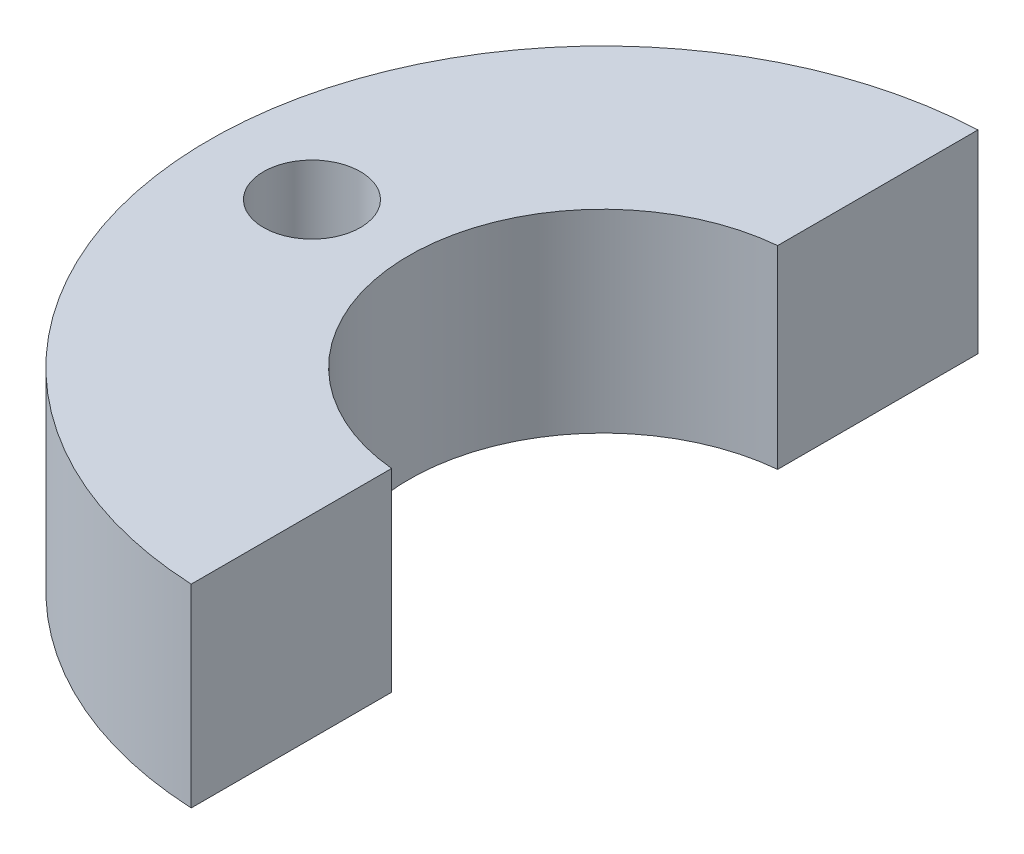
ISO-10303-21;
HEADER;
FILE_DESCRIPTION(('STEP AP214'),'2;1');
FILE_NAME('part.step','',(''),(''),'','','');
FILE_SCHEMA(('AUTOMOTIVE_DESIGN { 1 0 10303 214 1 1 1 1 }'));
ENDSEC;
DATA;
#1=APPLICATION_CONTEXT('core data for automotive mechanical design processes');
#2=APPLICATION_PROTOCOL_DEFINITION('international standard','automotive_design',2000,#1);
#3=PRODUCT_CONTEXT('',#1,'mechanical');
#4=PRODUCT('Part','Part','',(#3));
#5=PRODUCT_RELATED_PRODUCT_CATEGORY('part','',(#4));
#6=PRODUCT_DEFINITION_FORMATION('','',#4);
#7=PRODUCT_DEFINITION_CONTEXT('part definition',#1,'design');
#8=PRODUCT_DEFINITION('design','',#6,#7);
#9=PRODUCT_DEFINITION_SHAPE('','',#8);
#10=(LENGTH_UNIT() NAMED_UNIT(*) SI_UNIT(.MILLI.,.METRE.));
#11=(NAMED_UNIT(*) PLANE_ANGLE_UNIT() SI_UNIT($,.RADIAN.));
#12=(NAMED_UNIT(*) SI_UNIT($,.STERADIAN.) SOLID_ANGLE_UNIT());
#13=UNCERTAINTY_MEASURE_WITH_UNIT(LENGTH_MEASURE(1.E-05),#10,'distance_accuracy_value','');
#14=(GEOMETRIC_REPRESENTATION_CONTEXT(3) GLOBAL_UNCERTAINTY_ASSIGNED_CONTEXT((#13)) GLOBAL_UNIT_ASSIGNED_CONTEXT((#10,
#11,#12)) REPRESENTATION_CONTEXT('',''));
#15=CARTESIAN_POINT('',(0.,0.,0.));
#16=DIRECTION('',(0.,0.,1.));
#17=DIRECTION('',(1.,0.,0.));
#18=AXIS2_PLACEMENT_3D('',#15,#16,#17);
#19=CARTESIAN_POINT('',(-1.5,8.,0.));
#20=DIRECTION('',(1.,0.,0.));
#21=DIRECTION('',(0.,0.,-1.));
#22=AXIS2_PLACEMENT_3D('',#19,#20,#21);
#23=PLANE('',#22);
#24=DIRECTION('',(0.,0.,1.));
#25=VECTOR('',#24,1.);
#26=CARTESIAN_POINT('',(-1.5,-8.,0.));
#27=LINE('',#26,#25);
#28=CARTESIAN_POINT('',(-1.5,-8.,-32.4653661614959));
#29=VERTEX_POINT('',#28);
#30=CARTESIAN_POINT('',(-1.5,-8.,-15.929532322074));
#31=VERTEX_POINT('',#30);
#32=EDGE_CURVE('E106',#29,#31,#27,.T.);
#33=ORIENTED_EDGE('',*,*,#32,.F.);
#34=DIRECTION('',(0.,-1.,0.));
#35=VECTOR('',#34,1.);
#36=CARTESIAN_POINT('',(-1.5,8.,-32.4653661614959));
#37=LINE('',#36,#35);
#38=CARTESIAN_POINT('',(-1.5,8.,-32.4653661614959));
#39=VERTEX_POINT('',#38);
#40=EDGE_CURVE('E11',#39,#29,#37,.T.);
#41=ORIENTED_EDGE('',*,*,#40,.F.);
#42=DIRECTION('',(0.,0.,1.));
#43=VECTOR('',#42,1.);
#44=CARTESIAN_POINT('',(-1.5,8.,0.));
#45=LINE('',#44,#43);
#46=CARTESIAN_POINT('',(-1.5,8.,-15.929532322074));
#47=VERTEX_POINT('',#46);
#48=EDGE_CURVE('E88',#39,#47,#45,.T.);
#49=ORIENTED_EDGE('',*,*,#48,.T.);
#50=DIRECTION('',(0.,-1.,0.));
#51=VECTOR('',#50,1.);
#52=CARTESIAN_POINT('',(-1.5,8.,-15.929532322074));
#53=LINE('',#52,#51);
#54=EDGE_CURVE('E56',#47,#31,#53,.T.);
#55=ORIENTED_EDGE('',*,*,#54,.T.);
#56=EDGE_LOOP('',(#33,#41,#49,#55));
#57=FACE_BOUND('',#56,.T.);
#58=ADVANCED_FACE('F39',(#57),#23,.T.);
#59=CARTESIAN_POINT('',(0.,8.,0.));
#60=DIRECTION('',(0.,-1.,0.));
#61=DIRECTION('',(0.,0.,-1.));
#62=AXIS2_PLACEMENT_3D('',#59,#60,#61);
#63=CYLINDRICAL_SURFACE('',#62,32.5);
#64=CARTESIAN_POINT('',(0.,-8.,0.));
#65=DIRECTION('',(0.,1.,0.));
#66=DIRECTION('',(0.,0.,1.));
#67=AXIS2_PLACEMENT_3D('',#64,#65,#66);
#68=CIRCLE('',#67,32.5);
#69=CARTESIAN_POINT('',(-1.5,-8.,32.4653661614959));
#70=VERTEX_POINT('',#69);
#71=EDGE_CURVE('E94',#29,#70,#68,.T.);
#72=ORIENTED_EDGE('',*,*,#71,.T.);
#73=DIRECTION('',(0.,-1.,0.));
#74=VECTOR('',#73,1.);
#75=CARTESIAN_POINT('',(-1.5,8.,32.4653661614959));
#76=LINE('',#75,#74);
#77=CARTESIAN_POINT('',(-1.5,8.,32.4653661614959));
#78=VERTEX_POINT('',#77);
#79=EDGE_CURVE('E48',#78,#70,#76,.T.);
#80=ORIENTED_EDGE('',*,*,#79,.F.);
#81=CARTESIAN_POINT('',(0.,8.,0.));
#82=DIRECTION('',(0.,1.,0.));
#83=DIRECTION('',(0.,0.,1.));
#84=AXIS2_PLACEMENT_3D('',#81,#82,#83);
#85=CIRCLE('',#84,32.5);
#86=EDGE_CURVE('E82',#39,#78,#85,.T.);
#87=ORIENTED_EDGE('',*,*,#86,.F.);
#88=ORIENTED_EDGE('',*,*,#40,.T.);
#89=EDGE_LOOP('',(#72,#80,#87,#88));
#90=FACE_BOUND('',#89,.T.);
#91=ADVANCED_FACE('F92',(#90),#63,.T.);
#92=CARTESIAN_POINT('',(-1.5,8.,0.));
#93=DIRECTION('',(1.,0.,0.));
#94=DIRECTION('',(0.,0.,-1.));
#95=AXIS2_PLACEMENT_3D('',#92,#93,#94);
#96=PLANE('',#95);
#97=DIRECTION('',(0.,0.,1.));
#98=VECTOR('',#97,1.);
#99=CARTESIAN_POINT('',(-1.5,-8.,0.));
#100=LINE('',#99,#98);
#101=CARTESIAN_POINT('',(-1.5,-8.,15.929532322074));
#102=VERTEX_POINT('',#101);
#103=EDGE_CURVE('E109',#102,#70,#100,.T.);
#104=ORIENTED_EDGE('',*,*,#103,.F.);
#105=DIRECTION('',(0.,-1.,0.));
#106=VECTOR('',#105,1.);
#107=CARTESIAN_POINT('',(-1.5,8.,15.929532322074));
#108=LINE('',#107,#106);
#109=CARTESIAN_POINT('',(-1.5,8.,15.929532322074));
#110=VERTEX_POINT('',#109);
#111=EDGE_CURVE('E69',#110,#102,#108,.T.);
#112=ORIENTED_EDGE('',*,*,#111,.F.);
#113=DIRECTION('',(0.,0.,1.));
#114=VECTOR('',#113,1.);
#115=CARTESIAN_POINT('',(-1.5,8.,0.));
#116=LINE('',#115,#114);
#117=EDGE_CURVE('E87',#110,#78,#116,.T.);
#118=ORIENTED_EDGE('',*,*,#117,.T.);
#119=ORIENTED_EDGE('',*,*,#79,.T.);
#120=EDGE_LOOP('',(#104,#112,#118,#119));
#121=FACE_BOUND('',#120,.T.);
#122=ADVANCED_FACE('F97',(#121),#96,.T.);
#123=CARTESIAN_POINT('',(-24.,8.,0.));
#124=DIRECTION('',(0.,-1.,0.));
#125=DIRECTION('',(0.,0.,-1.));
#126=AXIS2_PLACEMENT_3D('',#123,#124,#125);
#127=CYLINDRICAL_SURFACE('',#126,4.);
#128=CARTESIAN_POINT('',(-24.,8.,0.));
#129=DIRECTION('',(0.,1.,0.));
#130=DIRECTION('',(0.,0.,1.));
#131=AXIS2_PLACEMENT_3D('',#128,#129,#130);
#132=CIRCLE('',#131,4.);
#133=CARTESIAN_POINT('',(-24.,8.,4.));
#134=VERTEX_POINT('',#133);
#135=EDGE_CURVE('E114',#134,#134,#132,.T.);
#136=ORIENTED_EDGE('',*,*,#135,.T.);
#137=EDGE_LOOP('',(#136));
#138=FACE_BOUND('',#137,.T.);
#139=CARTESIAN_POINT('',(-24.,-8.,0.));
#140=DIRECTION('',(0.,1.,0.));
#141=DIRECTION('',(0.,0.,1.));
#142=AXIS2_PLACEMENT_3D('',#139,#140,#141);
#143=CIRCLE('',#142,4.);
#144=CARTESIAN_POINT('',(-24.,-8.,4.));
#145=VERTEX_POINT('',#144);
#146=EDGE_CURVE('E103',#145,#145,#143,.T.);
#147=ORIENTED_EDGE('',*,*,#146,.F.);
#148=EDGE_LOOP('',(#147));
#149=FACE_BOUND('',#148,.T.);
#150=ADVANCED_FACE('F41',(#138,#149),#127,.F.);
#151=CARTESIAN_POINT('',(0.,8.,0.));
#152=DIRECTION('',(0.,-1.,0.));
#153=DIRECTION('',(0.,0.,-1.));
#154=AXIS2_PLACEMENT_3D('',#151,#152,#153);
#155=CYLINDRICAL_SURFACE('',#154,16.);
#156=CARTESIAN_POINT('',(0.,-8.,0.));
#157=DIRECTION('',(0.,1.,0.));
#158=DIRECTION('',(0.,0.,1.));
#159=AXIS2_PLACEMENT_3D('',#156,#157,#158);
#160=CIRCLE('',#159,16.);
#161=EDGE_CURVE('E111',#31,#102,#160,.T.);
#162=ORIENTED_EDGE('',*,*,#161,.F.);
#163=ORIENTED_EDGE('',*,*,#54,.F.);
#164=CARTESIAN_POINT('',(0.,8.,0.));
#165=DIRECTION('',(0.,1.,0.));
#166=DIRECTION('',(0.,0.,1.));
#167=AXIS2_PLACEMENT_3D('',#164,#165,#166);
#168=CIRCLE('',#167,16.);
#169=EDGE_CURVE('E98',#47,#110,#168,.T.);
#170=ORIENTED_EDGE('',*,*,#169,.T.);
#171=ORIENTED_EDGE('',*,*,#111,.T.);
#172=EDGE_LOOP('',(#162,#163,#170,#171));
#173=FACE_BOUND('',#172,.T.);
#174=ADVANCED_FACE('F121',(#173),#155,.F.);
#175=CARTESIAN_POINT('',(0.,8.,0.));
#176=DIRECTION('',(0.,1.,0.));
#177=DIRECTION('',(0.,0.,1.));
#178=AXIS2_PLACEMENT_3D('',#175,#176,#177);
#179=PLANE('',#178);
#180=ORIENTED_EDGE('',*,*,#135,.F.);
#181=EDGE_LOOP('',(#180));
#182=FACE_BOUND('',#181,.T.);
#183=ORIENTED_EDGE('',*,*,#48,.F.);
#184=ORIENTED_EDGE('',*,*,#86,.T.);
#185=ORIENTED_EDGE('',*,*,#117,.F.);
#186=ORIENTED_EDGE('',*,*,#169,.F.);
#187=EDGE_LOOP('',(#183,#184,#185,#186));
#188=FACE_BOUND('',#187,.T.);
#189=ADVANCED_FACE('F84',(#182,#188),#179,.T.);
#190=CARTESIAN_POINT('',(0.,-8.,0.));
#191=DIRECTION('',(0.,1.,0.));
#192=DIRECTION('',(0.,0.,1.));
#193=AXIS2_PLACEMENT_3D('',#190,#191,#192);
#194=PLANE('',#193);
#195=ORIENTED_EDGE('',*,*,#146,.T.);
#196=EDGE_LOOP('',(#195));
#197=FACE_BOUND('',#196,.T.);
#198=ORIENTED_EDGE('',*,*,#32,.T.);
#199=ORIENTED_EDGE('',*,*,#161,.T.);
#200=ORIENTED_EDGE('',*,*,#103,.T.);
#201=ORIENTED_EDGE('',*,*,#71,.F.);
#202=EDGE_LOOP('',(#198,#199,#200,#201));
#203=FACE_BOUND('',#202,.T.);
#204=ADVANCED_FACE('F128',(#197,#203),#194,.F.);
#205=CLOSED_SHELL('',(#58,#91,#122,#150,#174,#189,#204));
#206=MANIFOLD_SOLID_BREP('B2',#205);
#207=ADVANCED_BREP_SHAPE_REPRESENTATION('',(#18,#206),#14);
#208=SHAPE_DEFINITION_REPRESENTATION(#9,#207);
ENDSEC;
END-ISO-10303-21;
